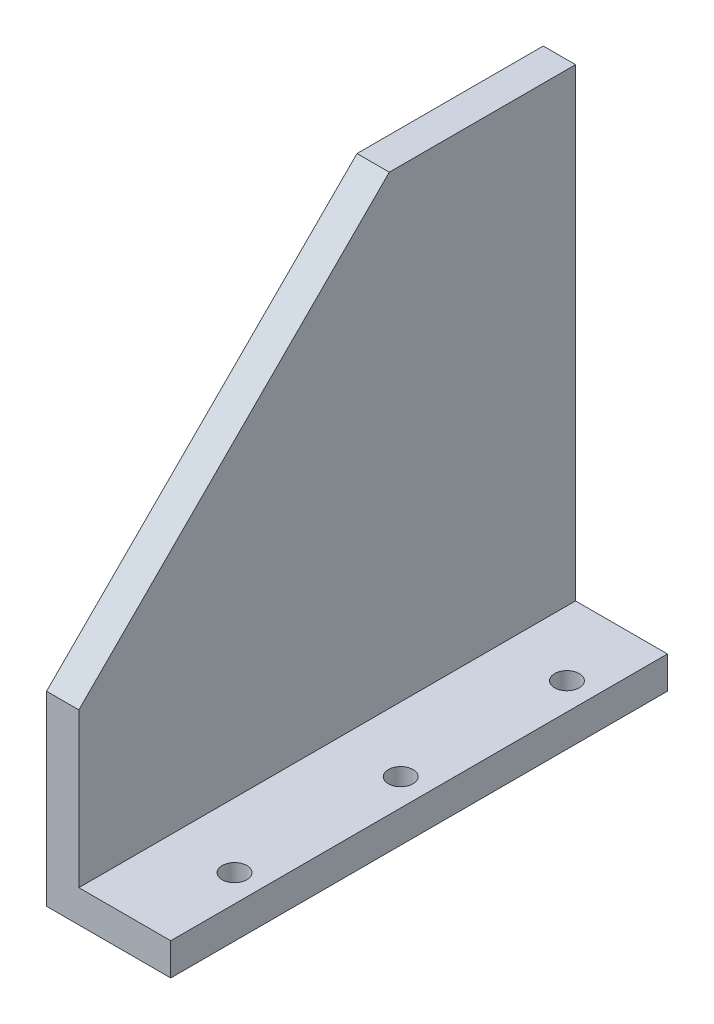
ISO-10303-21;
HEADER;
FILE_DESCRIPTION(('STEP AP214'),'2;1');
FILE_NAME('part.step','',(''),(''),'','','');
FILE_SCHEMA(('AUTOMOTIVE_DESIGN { 1 0 10303 214 1 1 1 1 }'));
ENDSEC;
DATA;
#1=APPLICATION_CONTEXT('core data for automotive mechanical design processes');
#2=APPLICATION_PROTOCOL_DEFINITION('international standard','automotive_design',2000,#1);
#3=PRODUCT_CONTEXT('',#1,'mechanical');
#4=PRODUCT('Part','Part','',(#3));
#5=PRODUCT_RELATED_PRODUCT_CATEGORY('part','',(#4));
#6=PRODUCT_DEFINITION_FORMATION('','',#4);
#7=PRODUCT_DEFINITION_CONTEXT('part definition',#1,'design');
#8=PRODUCT_DEFINITION('design','',#6,#7);
#9=PRODUCT_DEFINITION_SHAPE('','',#8);
#10=(LENGTH_UNIT() NAMED_UNIT(*) SI_UNIT(.MILLI.,.METRE.));
#11=(NAMED_UNIT(*) PLANE_ANGLE_UNIT() SI_UNIT($,.RADIAN.));
#12=(NAMED_UNIT(*) SI_UNIT($,.STERADIAN.) SOLID_ANGLE_UNIT());
#13=UNCERTAINTY_MEASURE_WITH_UNIT(LENGTH_MEASURE(1.E-05),#10,'distance_accuracy_value','');
#14=(GEOMETRIC_REPRESENTATION_CONTEXT(3) GLOBAL_UNCERTAINTY_ASSIGNED_CONTEXT((#13)) GLOBAL_UNIT_ASSIGNED_CONTEXT((#10,
#11,#12)) REPRESENTATION_CONTEXT('',''));
#15=CARTESIAN_POINT('',(0.,0.,0.));
#16=DIRECTION('',(0.,0.,1.));
#17=DIRECTION('',(1.,0.,0.));
#18=AXIS2_PLACEMENT_3D('',#15,#16,#17);
#19=CARTESIAN_POINT('',(12.7,0.,50.8));
#20=DIRECTION('',(0.,1.,0.));
#21=DIRECTION('',(-1.,0.,0.));
#22=AXIS2_PLACEMENT_3D('',#19,#20,#21);
#23=PLANE('',#22);
#24=CARTESIAN_POINT('',(9.92963481705276,0.,7.50785278153852));
#25=DIRECTION('',(0.,-1.,0.));
#26=DIRECTION('',(0.,0.,-1.));
#27=AXIS2_PLACEMENT_3D('',#24,#25,#26);
#28=CIRCLE('',#27,1.26364999999999);
#29=CARTESIAN_POINT('',(9.92963481705276,0.,6.24420278153854));
#30=VERTEX_POINT('',#29);
#31=EDGE_CURVE('E183',#30,#30,#28,.T.);
#32=ORIENTED_EDGE('',*,*,#31,.F.);
#33=EDGE_LOOP('',(#32));
#34=FACE_BOUND('',#33,.T.);
#35=CARTESIAN_POINT('',(9.92963481705276,0.,24.5106297025845));
#36=DIRECTION('',(0.,-1.,0.));
#37=DIRECTION('',(0.,0.,-1.));
#38=AXIS2_PLACEMENT_3D('',#35,#36,#37);
#39=CIRCLE('',#38,1.26364999999999);
#40=CARTESIAN_POINT('',(9.92963481705276,0.,23.2469797025845));
#41=VERTEX_POINT('',#40);
#42=EDGE_CURVE('E146',#41,#41,#39,.T.);
#43=ORIENTED_EDGE('',*,*,#42,.F.);
#44=EDGE_LOOP('',(#43));
#45=FACE_BOUND('',#44,.T.);
#46=CARTESIAN_POINT('',(9.92963481705276,0.,41.5078527815385));
#47=DIRECTION('',(0.,-1.,0.));
#48=DIRECTION('',(0.,0.,-1.));
#49=AXIS2_PLACEMENT_3D('',#46,#47,#48);
#50=CIRCLE('',#49,1.26364999999999);
#51=CARTESIAN_POINT('',(9.92963481705276,0.,40.2442027815385));
#52=VERTEX_POINT('',#51);
#53=EDGE_CURVE('E134',#52,#52,#50,.T.);
#54=ORIENTED_EDGE('',*,*,#53,.F.);
#55=EDGE_LOOP('',(#54));
#56=FACE_BOUND('',#55,.T.);
#57=DIRECTION('',(1.,0.,0.));
#58=VECTOR('',#57,1.);
#59=CARTESIAN_POINT('',(12.7,0.,0.));
#60=LINE('',#59,#58);
#61=CARTESIAN_POINT('',(0.,0.,0.));
#62=VERTEX_POINT('',#61);
#63=CARTESIAN_POINT('',(12.7,0.,0.));
#64=VERTEX_POINT('',#63);
#65=EDGE_CURVE('E133',#62,#64,#60,.T.);
#66=ORIENTED_EDGE('',*,*,#65,.T.);
#67=DIRECTION('',(0.,0.,-1.));
#68=VECTOR('',#67,1.);
#69=CARTESIAN_POINT('',(12.7,0.,50.8));
#70=LINE('',#69,#68);
#71=CARTESIAN_POINT('',(12.7,0.,50.8));
#72=VERTEX_POINT('',#71);
#73=EDGE_CURVE('E11',#72,#64,#70,.T.);
#74=ORIENTED_EDGE('',*,*,#73,.F.);
#75=DIRECTION('',(1.,0.,0.));
#76=VECTOR('',#75,1.);
#77=CARTESIAN_POINT('',(12.7,0.,50.8));
#78=LINE('',#77,#76);
#79=CARTESIAN_POINT('',(0.,0.,50.8));
#80=VERTEX_POINT('',#79);
#81=EDGE_CURVE('E150',#80,#72,#78,.T.);
#82=ORIENTED_EDGE('',*,*,#81,.F.);
#83=DIRECTION('',(0.,0.,-1.));
#84=VECTOR('',#83,1.);
#85=CARTESIAN_POINT('',(0.,0.,50.8));
#86=LINE('',#85,#84);
#87=EDGE_CURVE('E121',#80,#62,#86,.T.);
#88=ORIENTED_EDGE('',*,*,#87,.T.);
#89=EDGE_LOOP('',(#66,#74,#82,#88));
#90=FACE_BOUND('',#89,.T.);
#91=ADVANCED_FACE('F38',(#34,#45,#56,#90),#23,.F.);
#92=CARTESIAN_POINT('',(12.7,3.302,50.8));
#93=DIRECTION('',(-1.,0.,0.));
#94=DIRECTION('',(0.,0.,1.));
#95=AXIS2_PLACEMENT_3D('',#92,#93,#94);
#96=PLANE('',#95);
#97=DIRECTION('',(0.,1.,0.));
#98=VECTOR('',#97,1.);
#99=CARTESIAN_POINT('',(12.7,3.302,0.));
#100=LINE('',#99,#98);
#101=CARTESIAN_POINT('',(12.7,3.302,0.));
#102=VERTEX_POINT('',#101);
#103=EDGE_CURVE('E138',#64,#102,#100,.T.);
#104=ORIENTED_EDGE('',*,*,#103,.T.);
#105=DIRECTION('',(0.,0.,-1.));
#106=VECTOR('',#105,1.);
#107=CARTESIAN_POINT('',(12.7,3.302,50.8));
#108=LINE('',#107,#106);
#109=CARTESIAN_POINT('',(12.7,3.302,50.8));
#110=VERTEX_POINT('',#109);
#111=EDGE_CURVE('E46',#110,#102,#108,.T.);
#112=ORIENTED_EDGE('',*,*,#111,.F.);
#113=DIRECTION('',(0.,1.,0.));
#114=VECTOR('',#113,1.);
#115=CARTESIAN_POINT('',(12.7,3.302,50.8));
#116=LINE('',#115,#114);
#117=EDGE_CURVE('E96',#72,#110,#116,.T.);
#118=ORIENTED_EDGE('',*,*,#117,.F.);
#119=ORIENTED_EDGE('',*,*,#73,.T.);
#120=EDGE_LOOP('',(#104,#112,#118,#119));
#121=FACE_BOUND('',#120,.T.);
#122=ADVANCED_FACE('F179',(#121),#96,.F.);
#123=CARTESIAN_POINT('',(3.30200000000001,3.302,50.8));
#124=DIRECTION('',(0.,-1.,0.));
#125=DIRECTION('',(1.,0.,0.));
#126=AXIS2_PLACEMENT_3D('',#123,#124,#125);
#127=PLANE('',#126);
#128=CARTESIAN_POINT('',(9.92963481705276,3.302,7.50785278153852));
#129=DIRECTION('',(0.,-1.,0.));
#130=DIRECTION('',(1.,0.,0.));
#131=AXIS2_PLACEMENT_3D('',#128,#129,#130);
#132=CIRCLE('',#131,1.26364999999999);
#133=CARTESIAN_POINT('',(11.1932848170527,3.302,7.50785278153852));
#134=VERTEX_POINT('',#133);
#135=EDGE_CURVE('E41',#134,#134,#132,.T.);
#136=ORIENTED_EDGE('',*,*,#135,.T.);
#137=EDGE_LOOP('',(#136));
#138=FACE_BOUND('',#137,.T.);
#139=CARTESIAN_POINT('',(9.92963481705276,3.302,24.5106297025845));
#140=DIRECTION('',(0.,-1.,0.));
#141=DIRECTION('',(1.,0.,0.));
#142=AXIS2_PLACEMENT_3D('',#139,#140,#141);
#143=CIRCLE('',#142,1.26364999999999);
#144=CARTESIAN_POINT('',(11.1932848170527,3.302,24.5106297025845));
#145=VERTEX_POINT('',#144);
#146=EDGE_CURVE('E141',#145,#145,#143,.T.);
#147=ORIENTED_EDGE('',*,*,#146,.T.);
#148=EDGE_LOOP('',(#147));
#149=FACE_BOUND('',#148,.T.);
#150=CARTESIAN_POINT('',(9.92963481705276,3.302,41.5078527815385));
#151=DIRECTION('',(0.,-1.,0.));
#152=DIRECTION('',(1.,0.,0.));
#153=AXIS2_PLACEMENT_3D('',#150,#151,#152);
#154=CIRCLE('',#153,1.26364999999999);
#155=CARTESIAN_POINT('',(11.1932848170527,3.302,41.5078527815385));
#156=VERTEX_POINT('',#155);
#157=EDGE_CURVE('E131',#156,#156,#154,.T.);
#158=ORIENTED_EDGE('',*,*,#157,.T.);
#159=EDGE_LOOP('',(#158));
#160=FACE_BOUND('',#159,.T.);
#161=DIRECTION('',(-1.,0.,0.));
#162=VECTOR('',#161,1.);
#163=CARTESIAN_POINT('',(3.30200000000001,3.302,0.));
#164=LINE('',#163,#162);
#165=CARTESIAN_POINT('',(3.30200000000001,3.302,0.));
#166=VERTEX_POINT('',#165);
#167=EDGE_CURVE('E160',#102,#166,#164,.T.);
#168=ORIENTED_EDGE('',*,*,#167,.T.);
#169=DIRECTION('',(0.,0.,-1.));
#170=VECTOR('',#169,1.);
#171=CARTESIAN_POINT('',(3.30200000000001,3.302,50.8));
#172=LINE('',#171,#170);
#173=CARTESIAN_POINT('',(3.30200000000001,3.302,50.8));
#174=VERTEX_POINT('',#173);
#175=EDGE_CURVE('E123',#174,#166,#172,.T.);
#176=ORIENTED_EDGE('',*,*,#175,.F.);
#177=DIRECTION('',(-1.,0.,0.));
#178=VECTOR('',#177,1.);
#179=CARTESIAN_POINT('',(3.30200000000001,3.302,50.8));
#180=LINE('',#179,#178);
#181=EDGE_CURVE('E153',#110,#174,#180,.T.);
#182=ORIENTED_EDGE('',*,*,#181,.F.);
#183=ORIENTED_EDGE('',*,*,#111,.T.);
#184=EDGE_LOOP('',(#168,#176,#182,#183));
#185=FACE_BOUND('',#184,.T.);
#186=ADVANCED_FACE('F181',(#138,#149,#160,#185),#127,.F.);
#187=CARTESIAN_POINT('',(3.302,50.8,50.8));
#188=DIRECTION('',(-1.,0.,0.));
#189=DIRECTION('',(0.,-1.,0.));
#190=AXIS2_PLACEMENT_3D('',#187,#188,#189);
#191=PLANE('',#190);
#192=DIRECTION('',(0.,0.,-1.));
#193=VECTOR('',#192,1.);
#194=CARTESIAN_POINT('',(3.302,50.8,50.8));
#195=LINE('',#194,#193);
#196=CARTESIAN_POINT('',(3.302,50.8,19.05));
#197=VERTEX_POINT('',#196);
#198=CARTESIAN_POINT('',(3.302,50.8,0.));
#199=VERTEX_POINT('',#198);
#200=EDGE_CURVE('E120',#197,#199,#195,.T.);
#201=ORIENTED_EDGE('',*,*,#200,.F.);
#202=DIRECTION('',(0.,0.707106781186548,-0.707106781186548));
#203=VECTOR('',#202,1.);
#204=CARTESIAN_POINT('',(3.302,50.8,19.05));
#205=LINE('',#204,#203);
#206=CARTESIAN_POINT('',(3.302,19.05,50.8));
#207=VERTEX_POINT('',#206);
#208=EDGE_CURVE('E107',#207,#197,#205,.T.);
#209=ORIENTED_EDGE('',*,*,#208,.F.);
#210=DIRECTION('',(0.,1.,0.));
#211=VECTOR('',#210,1.);
#212=CARTESIAN_POINT('',(3.302,50.8,50.8));
#213=LINE('',#212,#211);
#214=EDGE_CURVE('E155',#174,#207,#213,.T.);
#215=ORIENTED_EDGE('',*,*,#214,.F.);
#216=ORIENTED_EDGE('',*,*,#175,.T.);
#217=DIRECTION('',(0.,1.,0.));
#218=VECTOR('',#217,1.);
#219=CARTESIAN_POINT('',(3.302,50.8,0.));
#220=LINE('',#219,#218);
#221=EDGE_CURVE('E162',#166,#199,#220,.T.);
#222=ORIENTED_EDGE('',*,*,#221,.T.);
#223=EDGE_LOOP('',(#201,#209,#215,#216,#222));
#224=FACE_BOUND('',#223,.T.);
#225=ADVANCED_FACE('F167',(#224),#191,.F.);
#226=CARTESIAN_POINT('',(0.,50.8,50.8));
#227=DIRECTION('',(0.,-1.,0.));
#228=DIRECTION('',(0.,0.,-1.));
#229=AXIS2_PLACEMENT_3D('',#226,#227,#228);
#230=PLANE('',#229);
#231=DIRECTION('',(0.,0.,-1.));
#232=VECTOR('',#231,1.);
#233=CARTESIAN_POINT('',(0.,50.8,50.8));
#234=LINE('',#233,#232);
#235=CARTESIAN_POINT('',(0.,50.8,19.05));
#236=VERTEX_POINT('',#235);
#237=CARTESIAN_POINT('',(0.,50.8,0.));
#238=VERTEX_POINT('',#237);
#239=EDGE_CURVE('E114',#236,#238,#234,.T.);
#240=ORIENTED_EDGE('',*,*,#239,.F.);
#241=DIRECTION('',(-1.,0.,0.));
#242=VECTOR('',#241,1.);
#243=CARTESIAN_POINT('',(48.2032806053458,50.8,19.05));
#244=LINE('',#243,#242);
#245=EDGE_CURVE('E104',#197,#236,#244,.T.);
#246=ORIENTED_EDGE('',*,*,#245,.F.);
#247=ORIENTED_EDGE('',*,*,#200,.T.);
#248=DIRECTION('',(-1.,0.,0.));
#249=VECTOR('',#248,1.);
#250=CARTESIAN_POINT('',(0.,50.8,0.));
#251=LINE('',#250,#249);
#252=EDGE_CURVE('E119',#199,#238,#251,.T.);
#253=ORIENTED_EDGE('',*,*,#252,.T.);
#254=EDGE_LOOP('',(#240,#246,#247,#253));
#255=FACE_BOUND('',#254,.T.);
#256=ADVANCED_FACE('F117',(#255),#230,.F.);
#257=CARTESIAN_POINT('',(0.,0.,50.8));
#258=DIRECTION('',(1.,0.,0.));
#259=DIRECTION('',(0.,0.,-1.));
#260=AXIS2_PLACEMENT_3D('',#257,#258,#259);
#261=PLANE('',#260);
#262=DIRECTION('',(0.,-1.,0.));
#263=VECTOR('',#262,1.);
#264=CARTESIAN_POINT('',(0.,0.,50.8));
#265=LINE('',#264,#263);
#266=CARTESIAN_POINT('',(0.,19.05,50.8));
#267=VERTEX_POINT('',#266);
#268=EDGE_CURVE('E62',#267,#80,#265,.T.);
#269=ORIENTED_EDGE('',*,*,#268,.F.);
#270=DIRECTION('',(0.,-0.707106781186548,0.707106781186548));
#271=VECTOR('',#270,1.);
#272=CARTESIAN_POINT('',(0.,50.8,19.05));
#273=LINE('',#272,#271);
#274=EDGE_CURVE('E54',#236,#267,#273,.T.);
#275=ORIENTED_EDGE('',*,*,#274,.F.);
#276=ORIENTED_EDGE('',*,*,#239,.T.);
#277=DIRECTION('',(0.,-1.,0.));
#278=VECTOR('',#277,1.);
#279=CARTESIAN_POINT('',(0.,0.,0.));
#280=LINE('',#279,#278);
#281=EDGE_CURVE('E89',#238,#62,#280,.T.);
#282=ORIENTED_EDGE('',*,*,#281,.T.);
#283=ORIENTED_EDGE('',*,*,#87,.F.);
#284=EDGE_LOOP('',(#269,#275,#276,#282,#283));
#285=FACE_BOUND('',#284,.T.);
#286=ADVANCED_FACE('F113',(#285),#261,.F.);
#287=CARTESIAN_POINT('',(0.,0.,50.8));
#288=DIRECTION('',(0.,0.,-1.));
#289=DIRECTION('',(-1.,0.,0.));
#290=AXIS2_PLACEMENT_3D('',#287,#288,#289);
#291=PLANE('',#290);
#292=ORIENTED_EDGE('',*,*,#214,.T.);
#293=DIRECTION('',(-1.,0.,0.));
#294=VECTOR('',#293,1.);
#295=CARTESIAN_POINT('',(48.2032806053458,19.05,50.8));
#296=LINE('',#295,#294);
#297=EDGE_CURVE('E111',#207,#267,#296,.T.);
#298=ORIENTED_EDGE('',*,*,#297,.T.);
#299=ORIENTED_EDGE('',*,*,#268,.T.);
#300=ORIENTED_EDGE('',*,*,#81,.T.);
#301=ORIENTED_EDGE('',*,*,#117,.T.);
#302=ORIENTED_EDGE('',*,*,#181,.T.);
#303=EDGE_LOOP('',(#292,#298,#299,#300,#301,#302));
#304=FACE_BOUND('',#303,.T.);
#305=ADVANCED_FACE('F177',(#304),#291,.F.);
#306=CARTESIAN_POINT('',(0.,0.,0.));
#307=DIRECTION('',(0.,0.,-1.));
#308=DIRECTION('',(-1.,0.,0.));
#309=AXIS2_PLACEMENT_3D('',#306,#307,#308);
#310=PLANE('',#309);
#311=ORIENTED_EDGE('',*,*,#65,.F.);
#312=ORIENTED_EDGE('',*,*,#281,.F.);
#313=ORIENTED_EDGE('',*,*,#252,.F.);
#314=ORIENTED_EDGE('',*,*,#221,.F.);
#315=ORIENTED_EDGE('',*,*,#167,.F.);
#316=ORIENTED_EDGE('',*,*,#103,.F.);
#317=EDGE_LOOP('',(#311,#312,#313,#314,#315,#316));
#318=FACE_BOUND('',#317,.T.);
#319=ADVANCED_FACE('F173',(#318),#310,.T.);
#320=CARTESIAN_POINT('',(9.92963481705276,0.,41.5078527815385));
#321=DIRECTION('',(0.,-1.,0.));
#322=DIRECTION('',(0.,0.,-1.));
#323=AXIS2_PLACEMENT_3D('',#320,#321,#322);
#324=CYLINDRICAL_SURFACE('',#323,1.26364999999999);
#325=ORIENTED_EDGE('',*,*,#53,.T.);
#326=EDGE_LOOP('',(#325));
#327=FACE_BOUND('',#326,.T.);
#328=ORIENTED_EDGE('',*,*,#157,.F.);
#329=EDGE_LOOP('',(#328));
#330=FACE_BOUND('',#329,.T.);
#331=ADVANCED_FACE('F205',(#327,#330),#324,.F.);
#332=CARTESIAN_POINT('',(9.92963481705276,0.,24.5106297025845));
#333=DIRECTION('',(0.,-1.,0.));
#334=DIRECTION('',(0.,0.,-1.));
#335=AXIS2_PLACEMENT_3D('',#332,#333,#334);
#336=CYLINDRICAL_SURFACE('',#335,1.26364999999999);
#337=ORIENTED_EDGE('',*,*,#42,.T.);
#338=EDGE_LOOP('',(#337));
#339=FACE_BOUND('',#338,.T.);
#340=ORIENTED_EDGE('',*,*,#146,.F.);
#341=EDGE_LOOP('',(#340));
#342=FACE_BOUND('',#341,.T.);
#343=ADVANCED_FACE('F197',(#339,#342),#336,.F.);
#344=CARTESIAN_POINT('',(9.92963481705276,0.,7.50785278153852));
#345=DIRECTION('',(0.,-1.,0.));
#346=DIRECTION('',(0.,0.,-1.));
#347=AXIS2_PLACEMENT_3D('',#344,#345,#346);
#348=CYLINDRICAL_SURFACE('',#347,1.26364999999999);
#349=ORIENTED_EDGE('',*,*,#31,.T.);
#350=EDGE_LOOP('',(#349));
#351=FACE_BOUND('',#350,.T.);
#352=ORIENTED_EDGE('',*,*,#135,.F.);
#353=EDGE_LOOP('',(#352));
#354=FACE_BOUND('',#353,.T.);
#355=ADVANCED_FACE('F195',(#351,#354),#348,.F.);
#356=CARTESIAN_POINT('',(48.2032806053458,50.8,19.05));
#357=DIRECTION('',(0.,-0.707106781186547,-0.707106781186547));
#358=DIRECTION('',(0.,0.707106781186548,-0.707106781186548));
#359=AXIS2_PLACEMENT_3D('',#356,#357,#358);
#360=PLANE('',#359);
#361=ORIENTED_EDGE('',*,*,#208,.T.);
#362=ORIENTED_EDGE('',*,*,#245,.T.);
#363=ORIENTED_EDGE('',*,*,#274,.T.);
#364=ORIENTED_EDGE('',*,*,#297,.F.);
#365=EDGE_LOOP('',(#361,#362,#363,#364));
#366=FACE_BOUND('',#365,.T.);
#367=ADVANCED_FACE('F105',(#366),#360,.F.);
#368=CLOSED_SHELL('',(#91,#122,#186,#225,#256,#286,#305,#319,#331,#343,#355,#367));
#369=MANIFOLD_SOLID_BREP('B2',#368);
#370=ADVANCED_BREP_SHAPE_REPRESENTATION('',(#18,#369),#14);
#371=SHAPE_DEFINITION_REPRESENTATION(#9,#370);
ENDSEC;
END-ISO-10303-21;
